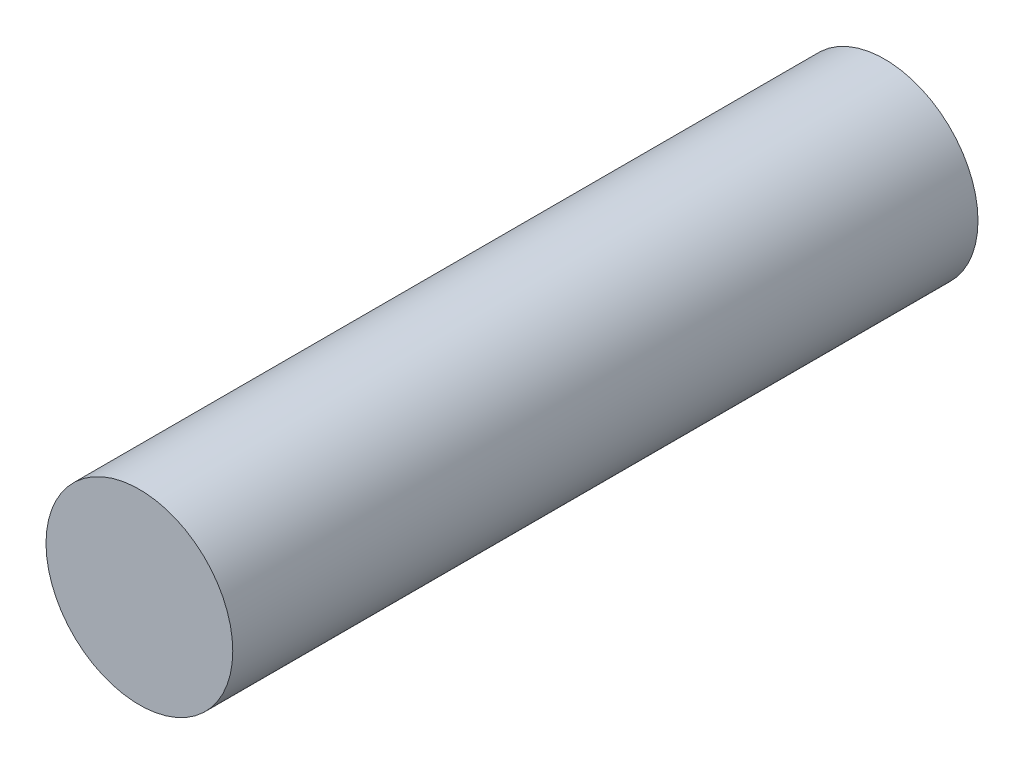
ISO-10303-21;
HEADER;
FILE_DESCRIPTION(('STEP AP214'),'2;1');
FILE_NAME('part.step','',(''),(''),'','','');
FILE_SCHEMA(('AUTOMOTIVE_DESIGN { 1 0 10303 214 1 1 1 1 }'));
ENDSEC;
DATA;
#1=APPLICATION_CONTEXT('core data for automotive mechanical design processes');
#2=APPLICATION_PROTOCOL_DEFINITION('international standard','automotive_design',2000,#1);
#3=PRODUCT_CONTEXT('',#1,'mechanical');
#4=PRODUCT('Part','Part','',(#3));
#5=PRODUCT_RELATED_PRODUCT_CATEGORY('part','',(#4));
#6=PRODUCT_DEFINITION_FORMATION('','',#4);
#7=PRODUCT_DEFINITION_CONTEXT('part definition',#1,'design');
#8=PRODUCT_DEFINITION('design','',#6,#7);
#9=PRODUCT_DEFINITION_SHAPE('','',#8);
#10=(LENGTH_UNIT() NAMED_UNIT(*) SI_UNIT(.MILLI.,.METRE.));
#11=(NAMED_UNIT(*) PLANE_ANGLE_UNIT() SI_UNIT($,.RADIAN.));
#12=(NAMED_UNIT(*) SI_UNIT($,.STERADIAN.) SOLID_ANGLE_UNIT());
#13=UNCERTAINTY_MEASURE_WITH_UNIT(LENGTH_MEASURE(1.E-05),#10,'distance_accuracy_value','');
#14=(GEOMETRIC_REPRESENTATION_CONTEXT(3) GLOBAL_UNCERTAINTY_ASSIGNED_CONTEXT((#13)) GLOBAL_UNIT_ASSIGNED_CONTEXT((#10,
#11,#12)) REPRESENTATION_CONTEXT('',''));
#15=CARTESIAN_POINT('',(0.,0.,0.));
#16=DIRECTION('',(0.,0.,1.));
#17=DIRECTION('',(1.,0.,0.));
#18=AXIS2_PLACEMENT_3D('',#15,#16,#17);
#19=CARTESIAN_POINT('',(0.,0.,50.673));
#20=DIRECTION('',(0.,0.,-1.));
#21=DIRECTION('',(-1.,0.,0.));
#22=AXIS2_PLACEMENT_3D('',#19,#20,#21);
#23=CYLINDRICAL_SURFACE('',#22,6.35);
#24=CARTESIAN_POINT('',(0.,0.,50.673));
#25=DIRECTION('',(0.,0.,1.));
#26=DIRECTION('',(1.,0.,0.));
#27=AXIS2_PLACEMENT_3D('',#24,#25,#26);
#28=CIRCLE('',#27,6.35);
#29=CARTESIAN_POINT('',(6.35,0.,50.673));
#30=VERTEX_POINT('',#29);
#31=EDGE_CURVE('E10',#30,#30,#28,.T.);
#32=ORIENTED_EDGE('',*,*,#31,.F.);
#33=EDGE_LOOP('',(#32));
#34=FACE_BOUND('',#33,.T.);
#35=CARTESIAN_POINT('',(0.,0.,0.));
#36=DIRECTION('',(0.,0.,1.));
#37=DIRECTION('',(1.,0.,0.));
#38=AXIS2_PLACEMENT_3D('',#35,#36,#37);
#39=CIRCLE('',#38,6.35);
#40=CARTESIAN_POINT('',(6.35,0.,0.));
#41=VERTEX_POINT('',#40);
#42=EDGE_CURVE('E38',#41,#41,#39,.T.);
#43=ORIENTED_EDGE('',*,*,#42,.T.);
#44=EDGE_LOOP('',(#43));
#45=FACE_BOUND('',#44,.T.);
#46=ADVANCED_FACE('F35',(#34,#45),#23,.T.);
#47=CARTESIAN_POINT('',(0.,0.,50.673));
#48=DIRECTION('',(0.,0.,1.));
#49=DIRECTION('',(1.,0.,0.));
#50=AXIS2_PLACEMENT_3D('',#47,#48,#49);
#51=PLANE('',#50);
#52=ORIENTED_EDGE('',*,*,#31,.T.);
#53=EDGE_LOOP('',(#52));
#54=FACE_BOUND('',#53,.T.);
#55=ADVANCED_FACE('F50',(#54),#51,.T.);
#56=CARTESIAN_POINT('',(0.,0.,0.));
#57=DIRECTION('',(0.,0.,1.));
#58=DIRECTION('',(1.,0.,0.));
#59=AXIS2_PLACEMENT_3D('',#56,#57,#58);
#60=PLANE('',#59);
#61=ORIENTED_EDGE('',*,*,#42,.F.);
#62=EDGE_LOOP('',(#61));
#63=FACE_BOUND('',#62,.T.);
#64=ADVANCED_FACE('F48',(#63),#60,.F.);
#65=CLOSED_SHELL('',(#46,#55,#64));
#66=MANIFOLD_SOLID_BREP('B2',#65);
#67=ADVANCED_BREP_SHAPE_REPRESENTATION('',(#18,#66),#14);
#68=SHAPE_DEFINITION_REPRESENTATION(#9,#67);
ENDSEC;
END-ISO-10303-21;
